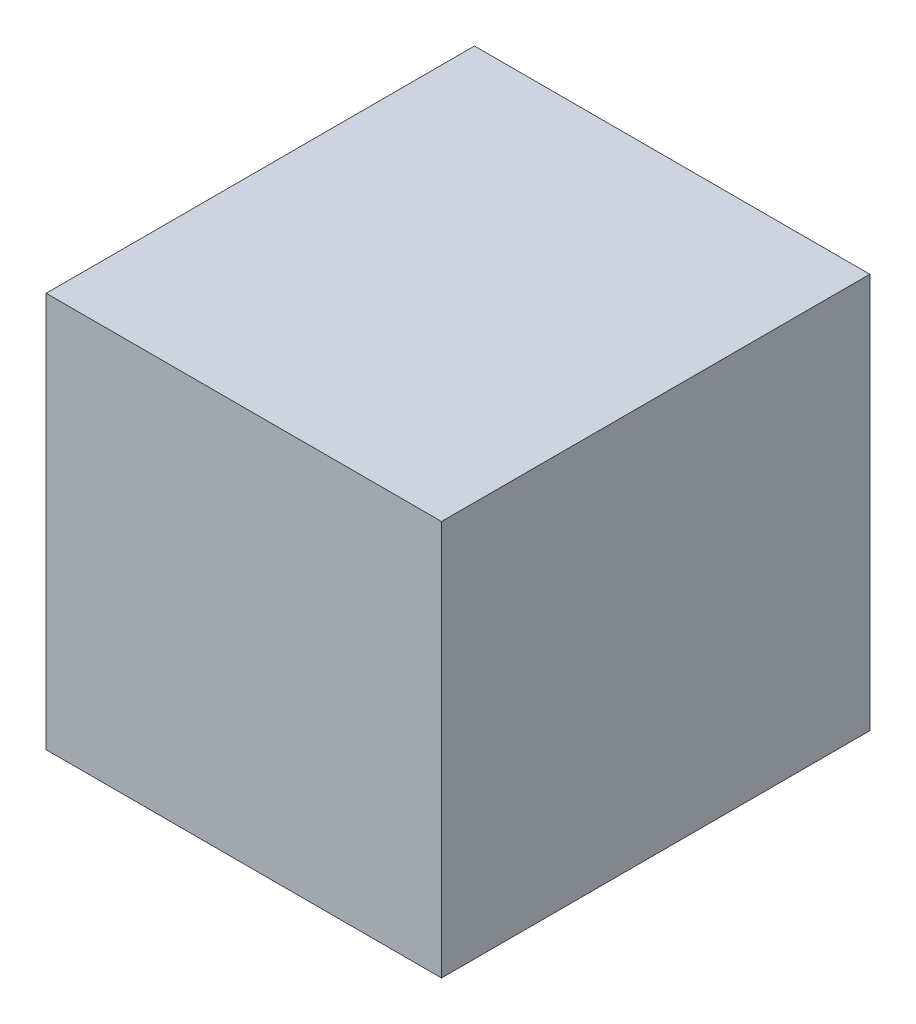
ISO-10303-21;
HEADER;
FILE_DESCRIPTION(('STEP AP214'),'2;1');
FILE_NAME('part.step','',(''),(''),'','','');
FILE_SCHEMA(('AUTOMOTIVE_DESIGN { 1 0 10303 214 1 1 1 1 }'));
ENDSEC;
DATA;
#1=APPLICATION_CONTEXT('core data for automotive mechanical design processes');
#2=APPLICATION_PROTOCOL_DEFINITION('international standard','automotive_design',2000,#1);
#3=PRODUCT_CONTEXT('',#1,'mechanical');
#4=PRODUCT('Part','Part','',(#3));
#5=PRODUCT_RELATED_PRODUCT_CATEGORY('part','',(#4));
#6=PRODUCT_DEFINITION_FORMATION('','',#4);
#7=PRODUCT_DEFINITION_CONTEXT('part definition',#1,'design');
#8=PRODUCT_DEFINITION('design','',#6,#7);
#9=PRODUCT_DEFINITION_SHAPE('','',#8);
#10=(LENGTH_UNIT() NAMED_UNIT(*) SI_UNIT(.MILLI.,.METRE.));
#11=(NAMED_UNIT(*) PLANE_ANGLE_UNIT() SI_UNIT($,.RADIAN.));
#12=(NAMED_UNIT(*) SI_UNIT($,.STERADIAN.) SOLID_ANGLE_UNIT());
#13=UNCERTAINTY_MEASURE_WITH_UNIT(LENGTH_MEASURE(1.E-05),#10,'distance_accuracy_value','');
#14=(GEOMETRIC_REPRESENTATION_CONTEXT(3) GLOBAL_UNCERTAINTY_ASSIGNED_CONTEXT((#13)) GLOBAL_UNIT_ASSIGNED_CONTEXT((#10,
#11,#12)) REPRESENTATION_CONTEXT('',''));
#15=CARTESIAN_POINT('',(0.,0.,0.));
#16=DIRECTION('',(0.,0.,1.));
#17=DIRECTION('',(1.,0.,0.));
#18=AXIS2_PLACEMENT_3D('',#15,#16,#17);
#19=CARTESIAN_POINT('',(60.,60.,65.));
#20=DIRECTION('',(-1.,0.,0.));
#21=DIRECTION('',(0.,0.,1.));
#22=AXIS2_PLACEMENT_3D('',#19,#20,#21);
#23=PLANE('',#22);
#24=DIRECTION('',(0.,0.,-1.));
#25=VECTOR('',#24,1.);
#26=CARTESIAN_POINT('',(60.,-60.,65.));
#27=LINE('',#26,#25);
#28=CARTESIAN_POINT('',(60.,-60.,65.));
#29=VERTEX_POINT('',#28);
#30=CARTESIAN_POINT('',(60.,-60.,-65.));
#31=VERTEX_POINT('',#30);
#32=EDGE_CURVE('E97',#29,#31,#27,.T.);
#33=ORIENTED_EDGE('',*,*,#32,.T.);
#34=DIRECTION('',(0.,-1.,0.));
#35=VECTOR('',#34,1.);
#36=CARTESIAN_POINT('',(60.,60.,-65.));
#37=LINE('',#36,#35);
#38=CARTESIAN_POINT('',(60.,60.,-65.));
#39=VERTEX_POINT('',#38);
#40=EDGE_CURVE('E11',#39,#31,#37,.T.);
#41=ORIENTED_EDGE('',*,*,#40,.F.);
#42=DIRECTION('',(0.,0.,-1.));
#43=VECTOR('',#42,1.);
#44=CARTESIAN_POINT('',(60.,60.,65.));
#45=LINE('',#44,#43);
#46=CARTESIAN_POINT('',(60.,60.,65.));
#47=VERTEX_POINT('',#46);
#48=EDGE_CURVE('E85',#47,#39,#45,.T.);
#49=ORIENTED_EDGE('',*,*,#48,.F.);
#50=DIRECTION('',(0.,-1.,0.));
#51=VECTOR('',#50,1.);
#52=CARTESIAN_POINT('',(60.,60.,65.));
#53=LINE('',#52,#51);
#54=EDGE_CURVE('E93',#47,#29,#53,.T.);
#55=ORIENTED_EDGE('',*,*,#54,.T.);
#56=EDGE_LOOP('',(#33,#41,#49,#55));
#57=FACE_BOUND('',#56,.T.);
#58=ADVANCED_FACE('F34',(#57),#23,.F.);
#59=CARTESIAN_POINT('',(-60.,60.,-65.));
#60=DIRECTION('',(0.,0.,1.));
#61=DIRECTION('',(1.,0.,0.));
#62=AXIS2_PLACEMENT_3D('',#59,#60,#61);
#63=PLANE('',#62);
#64=DIRECTION('',(-1.,0.,0.));
#65=VECTOR('',#64,1.);
#66=CARTESIAN_POINT('',(-60.,-60.,-65.));
#67=LINE('',#66,#65);
#68=CARTESIAN_POINT('',(-60.,-60.,-65.));
#69=VERTEX_POINT('',#68);
#70=EDGE_CURVE('E89',#31,#69,#67,.T.);
#71=ORIENTED_EDGE('',*,*,#70,.T.);
#72=DIRECTION('',(0.,-1.,0.));
#73=VECTOR('',#72,1.);
#74=CARTESIAN_POINT('',(-60.,60.,-65.));
#75=LINE('',#74,#73);
#76=CARTESIAN_POINT('',(-60.,60.,-65.));
#77=VERTEX_POINT('',#76);
#78=EDGE_CURVE('E42',#77,#69,#75,.T.);
#79=ORIENTED_EDGE('',*,*,#78,.F.);
#80=DIRECTION('',(-1.,0.,0.));
#81=VECTOR('',#80,1.);
#82=CARTESIAN_POINT('',(-60.,60.,-65.));
#83=LINE('',#82,#81);
#84=EDGE_CURVE('E80',#39,#77,#83,.T.);
#85=ORIENTED_EDGE('',*,*,#84,.F.);
#86=ORIENTED_EDGE('',*,*,#40,.T.);
#87=EDGE_LOOP('',(#71,#79,#85,#86));
#88=FACE_BOUND('',#87,.T.);
#89=ADVANCED_FACE('F88',(#88),#63,.F.);
#90=CARTESIAN_POINT('',(-60.,60.,65.));
#91=DIRECTION('',(1.,0.,0.));
#92=DIRECTION('',(0.,0.,-1.));
#93=AXIS2_PLACEMENT_3D('',#90,#91,#92);
#94=PLANE('',#93);
#95=DIRECTION('',(0.,0.,1.));
#96=VECTOR('',#95,1.);
#97=CARTESIAN_POINT('',(-60.,-60.,65.));
#98=LINE('',#97,#96);
#99=CARTESIAN_POINT('',(-60.,-60.,65.));
#100=VERTEX_POINT('',#99);
#101=EDGE_CURVE('E67',#69,#100,#98,.T.);
#102=ORIENTED_EDGE('',*,*,#101,.T.);
#103=DIRECTION('',(0.,-1.,0.));
#104=VECTOR('',#103,1.);
#105=CARTESIAN_POINT('',(-60.,60.,65.));
#106=LINE('',#105,#104);
#107=CARTESIAN_POINT('',(-60.,60.,65.));
#108=VERTEX_POINT('',#107);
#109=EDGE_CURVE('E90',#108,#100,#106,.T.);
#110=ORIENTED_EDGE('',*,*,#109,.F.);
#111=DIRECTION('',(0.,0.,1.));
#112=VECTOR('',#111,1.);
#113=CARTESIAN_POINT('',(-60.,60.,65.));
#114=LINE('',#113,#112);
#115=EDGE_CURVE('E83',#77,#108,#114,.T.);
#116=ORIENTED_EDGE('',*,*,#115,.F.);
#117=ORIENTED_EDGE('',*,*,#78,.T.);
#118=EDGE_LOOP('',(#102,#110,#116,#117));
#119=FACE_BOUND('',#118,.T.);
#120=ADVANCED_FACE('F91',(#119),#94,.F.);
#121=CARTESIAN_POINT('',(-60.,60.,65.));
#122=DIRECTION('',(0.,0.,-1.));
#123=DIRECTION('',(-1.,0.,0.));
#124=AXIS2_PLACEMENT_3D('',#121,#122,#123);
#125=PLANE('',#124);
#126=DIRECTION('',(1.,0.,0.));
#127=VECTOR('',#126,1.);
#128=CARTESIAN_POINT('',(-60.,-60.,65.));
#129=LINE('',#128,#127);
#130=EDGE_CURVE('E73',#100,#29,#129,.T.);
#131=ORIENTED_EDGE('',*,*,#130,.T.);
#132=ORIENTED_EDGE('',*,*,#54,.F.);
#133=DIRECTION('',(1.,0.,0.));
#134=VECTOR('',#133,1.);
#135=CARTESIAN_POINT('',(-60.,60.,65.));
#136=LINE('',#135,#134);
#137=EDGE_CURVE('E50',#108,#47,#136,.T.);
#138=ORIENTED_EDGE('',*,*,#137,.F.);
#139=ORIENTED_EDGE('',*,*,#109,.T.);
#140=EDGE_LOOP('',(#131,#132,#138,#139));
#141=FACE_BOUND('',#140,.T.);
#142=ADVANCED_FACE('F104',(#141),#125,.F.);
#143=CARTESIAN_POINT('',(0.,60.,0.));
#144=DIRECTION('',(0.,-1.,0.));
#145=DIRECTION('',(0.,0.,-1.));
#146=AXIS2_PLACEMENT_3D('',#143,#144,#145);
#147=PLANE('',#146);
#148=ORIENTED_EDGE('',*,*,#48,.T.);
#149=ORIENTED_EDGE('',*,*,#84,.T.);
#150=ORIENTED_EDGE('',*,*,#115,.T.);
#151=ORIENTED_EDGE('',*,*,#137,.T.);
#152=EDGE_LOOP('',(#148,#149,#150,#151));
#153=FACE_BOUND('',#152,.T.);
#154=ADVANCED_FACE('F81',(#153),#147,.F.);
#155=CARTESIAN_POINT('',(0.,-60.,0.));
#156=DIRECTION('',(0.,-1.,0.));
#157=DIRECTION('',(0.,0.,-1.));
#158=AXIS2_PLACEMENT_3D('',#155,#156,#157);
#159=PLANE('',#158);
#160=ORIENTED_EDGE('',*,*,#32,.F.);
#161=ORIENTED_EDGE('',*,*,#130,.F.);
#162=ORIENTED_EDGE('',*,*,#101,.F.);
#163=ORIENTED_EDGE('',*,*,#70,.F.);
#164=EDGE_LOOP('',(#160,#161,#162,#163));
#165=FACE_BOUND('',#164,.T.);
#166=ADVANCED_FACE('F107',(#165),#159,.T.);
#167=CLOSED_SHELL('',(#58,#89,#120,#142,#154,#166));
#168=MANIFOLD_SOLID_BREP('B2',#167);
#169=ADVANCED_BREP_SHAPE_REPRESENTATION('',(#18,#168),#14);
#170=SHAPE_DEFINITION_REPRESENTATION(#9,#169);
ENDSEC;
END-ISO-10303-21;
